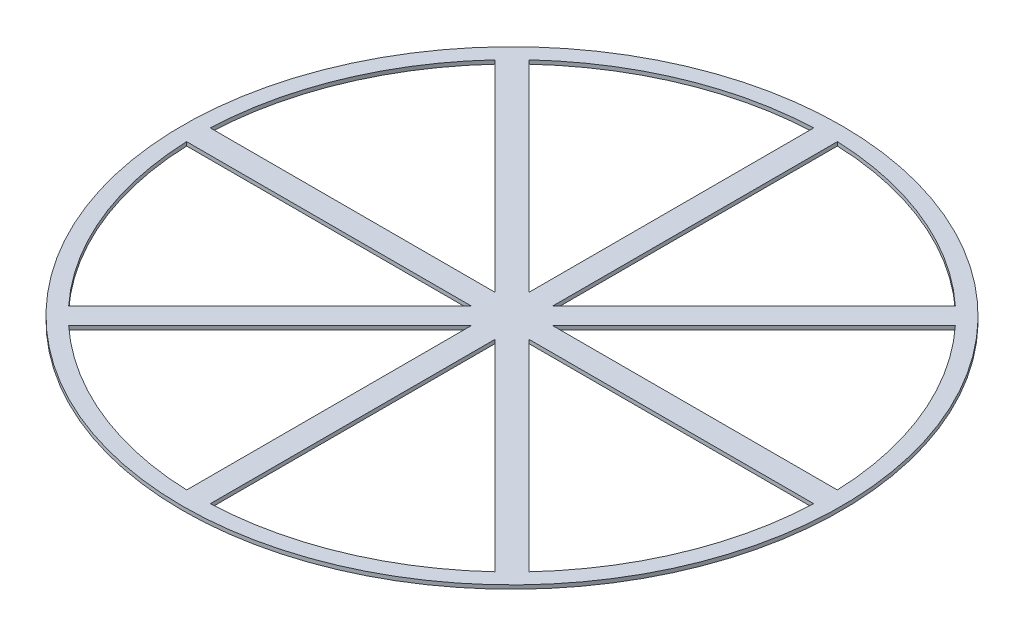
ISO-10303-21;
HEADER;
FILE_DESCRIPTION(('STEP AP214'),'2;1');
FILE_NAME('part.step','',(''),(''),'','','');
FILE_SCHEMA(('AUTOMOTIVE_DESIGN { 1 0 10303 214 1 1 1 1 }'));
ENDSEC;
DATA;
#1=APPLICATION_CONTEXT('core data for automotive mechanical design processes');
#2=APPLICATION_PROTOCOL_DEFINITION('international standard','automotive_design',2000,#1);
#3=PRODUCT_CONTEXT('',#1,'mechanical');
#4=PRODUCT('Part','Part','',(#3));
#5=PRODUCT_RELATED_PRODUCT_CATEGORY('part','',(#4));
#6=PRODUCT_DEFINITION_FORMATION('','',#4);
#7=PRODUCT_DEFINITION_CONTEXT('part definition',#1,'design');
#8=PRODUCT_DEFINITION('design','',#6,#7);
#9=PRODUCT_DEFINITION_SHAPE('','',#8);
#10=(LENGTH_UNIT() NAMED_UNIT(*) SI_UNIT(.MILLI.,.METRE.));
#11=(NAMED_UNIT(*) PLANE_ANGLE_UNIT() SI_UNIT($,.RADIAN.));
#12=(NAMED_UNIT(*) SI_UNIT($,.STERADIAN.) SOLID_ANGLE_UNIT());
#13=UNCERTAINTY_MEASURE_WITH_UNIT(LENGTH_MEASURE(1.E-05),#10,'distance_accuracy_value','');
#14=(GEOMETRIC_REPRESENTATION_CONTEXT(3) GLOBAL_UNCERTAINTY_ASSIGNED_CONTEXT((#13)) GLOBAL_UNIT_ASSIGNED_CONTEXT((#10,
#11,#12)) REPRESENTATION_CONTEXT('',''));
#15=CARTESIAN_POINT('',(0.,0.,0.));
#16=DIRECTION('',(0.,0.,1.));
#17=DIRECTION('',(1.,0.,0.));
#18=AXIS2_PLACEMENT_3D('',#15,#16,#17);
#19=CARTESIAN_POINT('',(0.,1.524,0.));
#20=DIRECTION('',(0.,-1.,0.));
#21=DIRECTION('',(0.,0.,-1.));
#22=AXIS2_PLACEMENT_3D('',#19,#20,#21);
#23=CYLINDRICAL_SURFACE('',#22,125.984);
#24=CARTESIAN_POINT('',(0.,0.,0.));
#25=DIRECTION('',(0.,1.,0.));
#26=DIRECTION('',(0.,0.,1.));
#27=AXIS2_PLACEMENT_3D('',#24,#25,#26);
#28=CIRCLE('',#27,125.984);
#29=CARTESIAN_POINT('',(-4.76249999999991,0.,-125.89395080682));
#30=VERTEX_POINT('',#29);
#31=CARTESIAN_POINT('',(-85.6528702804671,0.,-92.3880623712689));
#32=VERTEX_POINT('',#31);
#33=EDGE_CURVE('E210',#30,#32,#28,.T.);
#34=ORIENTED_EDGE('',*,*,#33,.F.);
#35=DIRECTION('',(0.,-1.,0.));
#36=VECTOR('',#35,1.);
#37=CARTESIAN_POINT('',(-4.76249999999991,1.524,-125.89395080682));
#38=LINE('',#37,#36);
#39=CARTESIAN_POINT('',(-4.76249999999991,1.524,-125.89395080682));
#40=VERTEX_POINT('',#39);
#41=EDGE_CURVE('E11',#40,#30,#38,.T.);
#42=ORIENTED_EDGE('',*,*,#41,.F.);
#43=CARTESIAN_POINT('',(0.,1.524,0.));
#44=DIRECTION('',(0.,1.,0.));
#45=DIRECTION('',(0.,0.,1.));
#46=AXIS2_PLACEMENT_3D('',#43,#44,#45);
#47=CIRCLE('',#46,125.984);
#48=CARTESIAN_POINT('',(-85.6528702804671,1.524,-92.3880623712689));
#49=VERTEX_POINT('',#48);
#50=EDGE_CURVE('E208',#40,#49,#47,.T.);
#51=ORIENTED_EDGE('',*,*,#50,.T.);
#52=DIRECTION('',(0.,-1.,0.));
#53=VECTOR('',#52,1.);
#54=CARTESIAN_POINT('',(-85.6528702804671,1.524,-92.3880623712689));
#55=LINE('',#54,#53);
#56=EDGE_CURVE('E60',#49,#32,#55,.T.);
#57=ORIENTED_EDGE('',*,*,#56,.T.);
#58=EDGE_LOOP('',(#34,#42,#51,#57));
#59=FACE_BOUND('',#58,.T.);
#60=ADVANCED_FACE('F41',(#59),#23,.F.);
#61=CARTESIAN_POINT('',(-4.76249999999999,1.524,0.));
#62=DIRECTION('',(1.,0.,0.));
#63=DIRECTION('',(0.,0.,-1.));
#64=AXIS2_PLACEMENT_3D('',#61,#62,#63);
#65=PLANE('',#64);
#66=DIRECTION('',(0.,0.,1.));
#67=VECTOR('',#66,1.);
#68=CARTESIAN_POINT('',(-4.76249999999999,0.,0.));
#69=LINE('',#68,#67);
#70=CARTESIAN_POINT('',(-4.76249999999998,0.,-11.4976920908018));
#71=VERTEX_POINT('',#70);
#72=EDGE_CURVE('E296',#30,#71,#69,.T.);
#73=ORIENTED_EDGE('',*,*,#72,.T.);
#74=DIRECTION('',(0.,-1.,0.));
#75=VECTOR('',#74,1.);
#76=CARTESIAN_POINT('',(-4.76249999999998,1.524,-11.4976920908018));
#77=LINE('',#76,#75);
#78=CARTESIAN_POINT('',(-4.76249999999998,1.524,-11.4976920908018));
#79=VERTEX_POINT('',#78);
#80=EDGE_CURVE('E51',#79,#71,#77,.T.);
#81=ORIENTED_EDGE('',*,*,#80,.F.);
#82=DIRECTION('',(0.,0.,1.));
#83=VECTOR('',#82,1.);
#84=CARTESIAN_POINT('',(-4.76249999999999,1.524,0.));
#85=LINE('',#84,#83);
#86=EDGE_CURVE('E213',#40,#79,#85,.T.);
#87=ORIENTED_EDGE('',*,*,#86,.F.);
#88=ORIENTED_EDGE('',*,*,#41,.T.);
#89=EDGE_LOOP('',(#73,#81,#87,#88));
#90=FACE_BOUND('',#89,.T.);
#91=ADVANCED_FACE('F214',(#90),#65,.F.);
#92=CARTESIAN_POINT('',(0.,1.524,0.));
#93=DIRECTION('',(0.,-1.,0.));
#94=DIRECTION('',(0.,0.,-1.));
#95=AXIS2_PLACEMENT_3D('',#92,#93,#94);
#96=CYLINDRICAL_SURFACE('',#95,125.984);
#97=CARTESIAN_POINT('',(0.,0.,0.));
#98=DIRECTION('',(0.,1.,0.));
#99=DIRECTION('',(0.,0.,1.));
#100=AXIS2_PLACEMENT_3D('',#97,#98,#99);
#101=CIRCLE('',#100,125.984);
#102=CARTESIAN_POINT('',(85.6528702804671,0.,-92.3880623712689));
#103=VERTEX_POINT('',#102);
#104=CARTESIAN_POINT('',(4.76249999999991,0.,-125.89395080682));
#105=VERTEX_POINT('',#104);
#106=EDGE_CURVE('E286',#103,#105,#101,.T.);
#107=ORIENTED_EDGE('',*,*,#106,.F.);
#108=DIRECTION('',(0.,-1.,0.));
#109=VECTOR('',#108,1.);
#110=CARTESIAN_POINT('',(85.6528702804671,1.524,-92.3880623712689));
#111=LINE('',#110,#109);
#112=CARTESIAN_POINT('',(85.6528702804671,1.524,-92.3880623712689));
#113=VERTEX_POINT('',#112);
#114=EDGE_CURVE('E306',#113,#103,#111,.T.);
#115=ORIENTED_EDGE('',*,*,#114,.F.);
#116=CARTESIAN_POINT('',(0.,1.524,0.));
#117=DIRECTION('',(0.,1.,0.));
#118=DIRECTION('',(0.,0.,1.));
#119=AXIS2_PLACEMENT_3D('',#116,#117,#118);
#120=CIRCLE('',#119,125.984);
#121=CARTESIAN_POINT('',(4.76249999999991,1.524,-125.89395080682));
#122=VERTEX_POINT('',#121);
#123=EDGE_CURVE('E404',#113,#122,#120,.T.);
#124=ORIENTED_EDGE('',*,*,#123,.T.);
#125=DIRECTION('',(0.,-1.,0.));
#126=VECTOR('',#125,1.);
#127=CARTESIAN_POINT('',(4.76249999999991,1.524,-125.89395080682));
#128=LINE('',#127,#126);
#129=EDGE_CURVE('E308',#122,#105,#128,.T.);
#130=ORIENTED_EDGE('',*,*,#129,.T.);
#131=EDGE_LOOP('',(#107,#115,#124,#130));
#132=FACE_BOUND('',#131,.T.);
#133=ADVANCED_FACE('F419',(#132),#96,.F.);
#134=CARTESIAN_POINT('',(-3.36759604540092,1.524,-3.36759604540093));
#135=DIRECTION('',(0.707106781186547,0.,0.707106781186548));
#136=DIRECTION('',(0.707106781186548,0.,-0.707106781186547));
#137=AXIS2_PLACEMENT_3D('',#134,#135,#136);
#138=PLANE('',#137);
#139=DIRECTION('',(-0.707106781186548,0.,0.707106781186547));
#140=VECTOR('',#139,1.);
#141=CARTESIAN_POINT('',(-3.36759604540092,0.,-3.36759604540093));
#142=LINE('',#141,#140);
#143=CARTESIAN_POINT('',(4.7625,0.,-11.4976920908018));
#144=VERTEX_POINT('',#143);
#145=EDGE_CURVE('E289',#103,#144,#142,.T.);
#146=ORIENTED_EDGE('',*,*,#145,.T.);
#147=DIRECTION('',(0.,-1.,0.));
#148=VECTOR('',#147,1.);
#149=CARTESIAN_POINT('',(4.7625,1.524,-11.4976920908018));
#150=LINE('',#149,#148);
#151=CARTESIAN_POINT('',(4.7625,1.524,-11.4976920908018));
#152=VERTEX_POINT('',#151);
#153=EDGE_CURVE('E310',#152,#144,#150,.T.);
#154=ORIENTED_EDGE('',*,*,#153,.F.);
#155=DIRECTION('',(-0.707106781186548,0.,0.707106781186547));
#156=VECTOR('',#155,1.);
#157=CARTESIAN_POINT('',(-3.36759604540092,1.524,-3.36759604540093));
#158=LINE('',#157,#156);
#159=EDGE_CURVE('E223',#113,#152,#158,.T.);
#160=ORIENTED_EDGE('',*,*,#159,.F.);
#161=ORIENTED_EDGE('',*,*,#114,.T.);
#162=EDGE_LOOP('',(#146,#154,#160,#161));
#163=FACE_BOUND('',#162,.T.);
#164=ADVANCED_FACE('F412',(#163),#138,.F.);
#165=CARTESIAN_POINT('',(0.,1.524,0.));
#166=DIRECTION('',(0.,-1.,0.));
#167=DIRECTION('',(0.,0.,-1.));
#168=AXIS2_PLACEMENT_3D('',#165,#166,#167);
#169=CYLINDRICAL_SURFACE('',#168,125.984);
#170=CARTESIAN_POINT('',(0.,0.,0.));
#171=DIRECTION('',(0.,1.,0.));
#172=DIRECTION('',(0.,0.,1.));
#173=AXIS2_PLACEMENT_3D('',#170,#171,#172);
#174=CIRCLE('',#173,125.984);
#175=CARTESIAN_POINT('',(125.89395080682,0.,-4.7625000000001));
#176=VERTEX_POINT('',#175);
#177=CARTESIAN_POINT('',(92.3880623712689,0.,-85.6528702804671));
#178=VERTEX_POINT('',#177);
#179=EDGE_CURVE('E277',#176,#178,#174,.T.);
#180=ORIENTED_EDGE('',*,*,#179,.F.);
#181=DIRECTION('',(0.,-1.,0.));
#182=VECTOR('',#181,1.);
#183=CARTESIAN_POINT('',(125.89395080682,1.524,-4.7625000000001));
#184=LINE('',#183,#182);
#185=CARTESIAN_POINT('',(125.89395080682,1.524,-4.7625000000001));
#186=VERTEX_POINT('',#185);
#187=EDGE_CURVE('E311',#186,#176,#184,.T.);
#188=ORIENTED_EDGE('',*,*,#187,.F.);
#189=CARTESIAN_POINT('',(0.,1.524,0.));
#190=DIRECTION('',(0.,1.,0.));
#191=DIRECTION('',(0.,0.,1.));
#192=AXIS2_PLACEMENT_3D('',#189,#190,#191);
#193=CIRCLE('',#192,125.984);
#194=CARTESIAN_POINT('',(92.3880623712689,1.524,-85.6528702804671));
#195=VERTEX_POINT('',#194);
#196=EDGE_CURVE('E396',#186,#195,#193,.T.);
#197=ORIENTED_EDGE('',*,*,#196,.T.);
#198=DIRECTION('',(0.,-1.,0.));
#199=VECTOR('',#198,1.);
#200=CARTESIAN_POINT('',(92.3880623712689,1.524,-85.6528702804671));
#201=LINE('',#200,#199);
#202=EDGE_CURVE('E314',#195,#178,#201,.T.);
#203=ORIENTED_EDGE('',*,*,#202,.T.);
#204=EDGE_LOOP('',(#180,#188,#197,#203));
#205=FACE_BOUND('',#204,.T.);
#206=ADVANCED_FACE('F453',(#205),#169,.F.);
#207=CARTESIAN_POINT('',(0.,1.524,-4.76249999999997));
#208=DIRECTION('',(0.,0.,1.));
#209=DIRECTION('',(1.,0.,0.));
#210=AXIS2_PLACEMENT_3D('',#207,#208,#209);
#211=PLANE('',#210);
#212=DIRECTION('',(-1.,0.,0.));
#213=VECTOR('',#212,1.);
#214=CARTESIAN_POINT('',(0.,0.,-4.76249999999997));
#215=LINE('',#214,#213);
#216=CARTESIAN_POINT('',(11.4976920908019,0.,-4.76249999999998));
#217=VERTEX_POINT('',#216);
#218=EDGE_CURVE('E280',#176,#217,#215,.T.);
#219=ORIENTED_EDGE('',*,*,#218,.T.);
#220=DIRECTION('',(0.,-1.,0.));
#221=VECTOR('',#220,1.);
#222=CARTESIAN_POINT('',(11.4976920908019,1.524,-4.76249999999998));
#223=LINE('',#222,#221);
#224=CARTESIAN_POINT('',(11.4976920908019,1.524,-4.76249999999998));
#225=VERTEX_POINT('',#224);
#226=EDGE_CURVE('E316',#225,#217,#223,.T.);
#227=ORIENTED_EDGE('',*,*,#226,.F.);
#228=DIRECTION('',(-1.,0.,0.));
#229=VECTOR('',#228,1.);
#230=CARTESIAN_POINT('',(0.,1.524,-4.76249999999997));
#231=LINE('',#230,#229);
#232=EDGE_CURVE('E399',#186,#225,#231,.T.);
#233=ORIENTED_EDGE('',*,*,#232,.F.);
#234=ORIENTED_EDGE('',*,*,#187,.T.);
#235=EDGE_LOOP('',(#219,#227,#233,#234));
#236=FACE_BOUND('',#235,.T.);
#237=ADVANCED_FACE('F460',(#236),#211,.F.);
#238=CARTESIAN_POINT('',(0.,1.524,0.));
#239=DIRECTION('',(0.,-1.,0.));
#240=DIRECTION('',(0.,0.,-1.));
#241=AXIS2_PLACEMENT_3D('',#238,#239,#240);
#242=CYLINDRICAL_SURFACE('',#241,125.984);
#243=CARTESIAN_POINT('',(0.,0.,0.));
#244=DIRECTION('',(0.,1.,0.));
#245=DIRECTION('',(0.,0.,1.));
#246=AXIS2_PLACEMENT_3D('',#243,#244,#245);
#247=CIRCLE('',#246,125.984);
#248=CARTESIAN_POINT('',(92.3880623712689,0.,85.6528702804671));
#249=VERTEX_POINT('',#248);
#250=CARTESIAN_POINT('',(125.89395080682,0.,4.7625000000001));
#251=VERTEX_POINT('',#250);
#252=EDGE_CURVE('E268',#249,#251,#247,.T.);
#253=ORIENTED_EDGE('',*,*,#252,.F.);
#254=DIRECTION('',(0.,-1.,0.));
#255=VECTOR('',#254,1.);
#256=CARTESIAN_POINT('',(92.3880623712689,1.524,85.6528702804671));
#257=LINE('',#256,#255);
#258=CARTESIAN_POINT('',(92.3880623712689,1.524,85.6528702804671));
#259=VERTEX_POINT('',#258);
#260=EDGE_CURVE('E317',#259,#249,#257,.T.);
#261=ORIENTED_EDGE('',*,*,#260,.F.);
#262=CARTESIAN_POINT('',(0.,1.524,0.));
#263=DIRECTION('',(0.,1.,0.));
#264=DIRECTION('',(0.,0.,1.));
#265=AXIS2_PLACEMENT_3D('',#262,#263,#264);
#266=CIRCLE('',#265,125.984);
#267=CARTESIAN_POINT('',(125.89395080682,1.524,4.7625000000001));
#268=VERTEX_POINT('',#267);
#269=EDGE_CURVE('E388',#259,#268,#266,.T.);
#270=ORIENTED_EDGE('',*,*,#269,.T.);
#271=DIRECTION('',(0.,-1.,0.));
#272=VECTOR('',#271,1.);
#273=CARTESIAN_POINT('',(125.89395080682,1.524,4.7625000000001));
#274=LINE('',#273,#272);
#275=EDGE_CURVE('E320',#268,#251,#274,.T.);
#276=ORIENTED_EDGE('',*,*,#275,.T.);
#277=EDGE_LOOP('',(#253,#261,#270,#276));
#278=FACE_BOUND('',#277,.T.);
#279=ADVANCED_FACE('F463',(#278),#242,.F.);
#280=CARTESIAN_POINT('',(3.36759604540093,1.524,-3.36759604540092));
#281=DIRECTION('',(-0.707106781186548,0.,0.707106781186547));
#282=DIRECTION('',(0.707106781186547,0.,0.707106781186548));
#283=AXIS2_PLACEMENT_3D('',#280,#281,#282);
#284=PLANE('',#283);
#285=DIRECTION('',(-0.707106781186547,0.,-0.707106781186548));
#286=VECTOR('',#285,1.);
#287=CARTESIAN_POINT('',(3.36759604540093,0.,-3.36759604540092));
#288=LINE('',#287,#286);
#289=CARTESIAN_POINT('',(11.4976920908018,0.,4.76249999999999));
#290=VERTEX_POINT('',#289);
#291=EDGE_CURVE('E271',#249,#290,#288,.T.);
#292=ORIENTED_EDGE('',*,*,#291,.T.);
#293=DIRECTION('',(0.,-1.,0.));
#294=VECTOR('',#293,1.);
#295=CARTESIAN_POINT('',(11.4976920908018,1.524,4.76249999999999));
#296=LINE('',#295,#294);
#297=CARTESIAN_POINT('',(11.4976920908018,1.524,4.76249999999999));
#298=VERTEX_POINT('',#297);
#299=EDGE_CURVE('E322',#298,#290,#296,.T.);
#300=ORIENTED_EDGE('',*,*,#299,.F.);
#301=DIRECTION('',(-0.707106781186547,0.,-0.707106781186548));
#302=VECTOR('',#301,1.);
#303=CARTESIAN_POINT('',(3.36759604540093,1.524,-3.36759604540092));
#304=LINE('',#303,#302);
#305=EDGE_CURVE('E391',#259,#298,#304,.T.);
#306=ORIENTED_EDGE('',*,*,#305,.F.);
#307=ORIENTED_EDGE('',*,*,#260,.T.);
#308=EDGE_LOOP('',(#292,#300,#306,#307));
#309=FACE_BOUND('',#308,.T.);
#310=ADVANCED_FACE('F472',(#309),#284,.F.);
#311=CARTESIAN_POINT('',(0.,1.524,0.));
#312=DIRECTION('',(0.,-1.,0.));
#313=DIRECTION('',(0.,0.,-1.));
#314=AXIS2_PLACEMENT_3D('',#311,#312,#313);
#315=CYLINDRICAL_SURFACE('',#314,125.984);
#316=CARTESIAN_POINT('',(0.,0.,0.));
#317=DIRECTION('',(0.,1.,0.));
#318=DIRECTION('',(0.,0.,1.));
#319=AXIS2_PLACEMENT_3D('',#316,#317,#318);
#320=CIRCLE('',#319,125.984);
#321=CARTESIAN_POINT('',(4.76249999999991,0.,125.89395080682));
#322=VERTEX_POINT('',#321);
#323=CARTESIAN_POINT('',(85.6528702804671,0.,92.3880623712689));
#324=VERTEX_POINT('',#323);
#325=EDGE_CURVE('E259',#322,#324,#320,.T.);
#326=ORIENTED_EDGE('',*,*,#325,.F.);
#327=DIRECTION('',(0.,-1.,0.));
#328=VECTOR('',#327,1.);
#329=CARTESIAN_POINT('',(4.76249999999991,1.524,125.89395080682));
#330=LINE('',#329,#328);
#331=CARTESIAN_POINT('',(4.76249999999991,1.524,125.89395080682));
#332=VERTEX_POINT('',#331);
#333=EDGE_CURVE('E323',#332,#322,#330,.T.);
#334=ORIENTED_EDGE('',*,*,#333,.F.);
#335=CARTESIAN_POINT('',(0.,1.524,0.));
#336=DIRECTION('',(0.,1.,0.));
#337=DIRECTION('',(0.,0.,1.));
#338=AXIS2_PLACEMENT_3D('',#335,#336,#337);
#339=CIRCLE('',#338,125.984);
#340=CARTESIAN_POINT('',(85.6528702804671,1.524,92.3880623712689));
#341=VERTEX_POINT('',#340);
#342=EDGE_CURVE('E380',#332,#341,#339,.T.);
#343=ORIENTED_EDGE('',*,*,#342,.T.);
#344=DIRECTION('',(0.,-1.,0.));
#345=VECTOR('',#344,1.);
#346=CARTESIAN_POINT('',(85.6528702804671,1.524,92.3880623712689));
#347=LINE('',#346,#345);
#348=EDGE_CURVE('E326',#341,#324,#347,.T.);
#349=ORIENTED_EDGE('',*,*,#348,.T.);
#350=EDGE_LOOP('',(#326,#334,#343,#349));
#351=FACE_BOUND('',#350,.T.);
#352=ADVANCED_FACE('F475',(#351),#315,.F.);
#353=CARTESIAN_POINT('',(4.7625,1.524,0.));
#354=DIRECTION('',(-1.,0.,0.));
#355=DIRECTION('',(0.,0.,1.));
#356=AXIS2_PLACEMENT_3D('',#353,#354,#355);
#357=PLANE('',#356);
#358=DIRECTION('',(0.,0.,-1.));
#359=VECTOR('',#358,1.);
#360=CARTESIAN_POINT('',(4.7625,0.,0.));
#361=LINE('',#360,#359);
#362=CARTESIAN_POINT('',(4.7625,0.,11.4976920908019));
#363=VERTEX_POINT('',#362);
#364=EDGE_CURVE('E262',#322,#363,#361,.T.);
#365=ORIENTED_EDGE('',*,*,#364,.T.);
#366=DIRECTION('',(0.,-1.,0.));
#367=VECTOR('',#366,1.);
#368=CARTESIAN_POINT('',(4.7625,1.524,11.4976920908019));
#369=LINE('',#368,#367);
#370=CARTESIAN_POINT('',(4.7625,1.524,11.4976920908019));
#371=VERTEX_POINT('',#370);
#372=EDGE_CURVE('E328',#371,#363,#369,.T.);
#373=ORIENTED_EDGE('',*,*,#372,.F.);
#374=DIRECTION('',(0.,0.,-1.));
#375=VECTOR('',#374,1.);
#376=CARTESIAN_POINT('',(4.7625,1.524,0.));
#377=LINE('',#376,#375);
#378=EDGE_CURVE('E383',#332,#371,#377,.T.);
#379=ORIENTED_EDGE('',*,*,#378,.F.);
#380=ORIENTED_EDGE('',*,*,#333,.T.);
#381=EDGE_LOOP('',(#365,#373,#379,#380));
#382=FACE_BOUND('',#381,.T.);
#383=ADVANCED_FACE('F484',(#382),#357,.F.);
#384=CARTESIAN_POINT('',(0.,1.524,0.));
#385=DIRECTION('',(0.,-1.,0.));
#386=DIRECTION('',(0.,0.,-1.));
#387=AXIS2_PLACEMENT_3D('',#384,#385,#386);
#388=CYLINDRICAL_SURFACE('',#387,125.984);
#389=CARTESIAN_POINT('',(0.,0.,0.));
#390=DIRECTION('',(0.,1.,0.));
#391=DIRECTION('',(0.,0.,1.));
#392=AXIS2_PLACEMENT_3D('',#389,#390,#391);
#393=CIRCLE('',#392,125.984);
#394=CARTESIAN_POINT('',(-85.6528702804671,0.,92.3880623712689));
#395=VERTEX_POINT('',#394);
#396=CARTESIAN_POINT('',(-4.76249999999991,0.,125.89395080682));
#397=VERTEX_POINT('',#396);
#398=EDGE_CURVE('E250',#395,#397,#393,.T.);
#399=ORIENTED_EDGE('',*,*,#398,.F.);
#400=DIRECTION('',(0.,-1.,0.));
#401=VECTOR('',#400,1.);
#402=CARTESIAN_POINT('',(-85.6528702804671,1.524,92.3880623712689));
#403=LINE('',#402,#401);
#404=CARTESIAN_POINT('',(-85.6528702804671,1.524,92.3880623712689));
#405=VERTEX_POINT('',#404);
#406=EDGE_CURVE('E329',#405,#395,#403,.T.);
#407=ORIENTED_EDGE('',*,*,#406,.F.);
#408=CARTESIAN_POINT('',(0.,1.524,0.));
#409=DIRECTION('',(0.,1.,0.));
#410=DIRECTION('',(0.,0.,1.));
#411=AXIS2_PLACEMENT_3D('',#408,#409,#410);
#412=CIRCLE('',#411,125.984);
#413=CARTESIAN_POINT('',(-4.76249999999991,1.524,125.89395080682));
#414=VERTEX_POINT('',#413);
#415=EDGE_CURVE('E372',#405,#414,#412,.T.);
#416=ORIENTED_EDGE('',*,*,#415,.T.);
#417=DIRECTION('',(0.,-1.,0.));
#418=VECTOR('',#417,1.);
#419=CARTESIAN_POINT('',(-4.76249999999991,1.524,125.89395080682));
#420=LINE('',#419,#418);
#421=EDGE_CURVE('E332',#414,#397,#420,.T.);
#422=ORIENTED_EDGE('',*,*,#421,.T.);
#423=EDGE_LOOP('',(#399,#407,#416,#422));
#424=FACE_BOUND('',#423,.T.);
#425=ADVANCED_FACE('F487',(#424),#388,.F.);
#426=CARTESIAN_POINT('',(3.36759604540092,1.524,3.36759604540093));
#427=DIRECTION('',(-0.707106781186547,0.,-0.707106781186548));
#428=DIRECTION('',(-0.707106781186548,0.,0.707106781186547));
#429=AXIS2_PLACEMENT_3D('',#426,#427,#428);
#430=PLANE('',#429);
#431=DIRECTION('',(0.707106781186548,0.,-0.707106781186547));
#432=VECTOR('',#431,1.);
#433=CARTESIAN_POINT('',(3.36759604540092,0.,3.36759604540093));
#434=LINE('',#433,#432);
#435=CARTESIAN_POINT('',(-4.7625,0.,11.4976920908018));
#436=VERTEX_POINT('',#435);
#437=EDGE_CURVE('E253',#395,#436,#434,.T.);
#438=ORIENTED_EDGE('',*,*,#437,.T.);
#439=DIRECTION('',(0.,-1.,0.));
#440=VECTOR('',#439,1.);
#441=CARTESIAN_POINT('',(-4.7625,1.524,11.4976920908018));
#442=LINE('',#441,#440);
#443=CARTESIAN_POINT('',(-4.7625,1.524,11.4976920908018));
#444=VERTEX_POINT('',#443);
#445=EDGE_CURVE('E334',#444,#436,#442,.T.);
#446=ORIENTED_EDGE('',*,*,#445,.F.);
#447=DIRECTION('',(0.707106781186548,0.,-0.707106781186547));
#448=VECTOR('',#447,1.);
#449=CARTESIAN_POINT('',(3.36759604540092,1.524,3.36759604540093));
#450=LINE('',#449,#448);
#451=EDGE_CURVE('E375',#405,#444,#450,.T.);
#452=ORIENTED_EDGE('',*,*,#451,.F.);
#453=ORIENTED_EDGE('',*,*,#406,.T.);
#454=EDGE_LOOP('',(#438,#446,#452,#453));
#455=FACE_BOUND('',#454,.T.);
#456=ADVANCED_FACE('F495',(#455),#430,.F.);
#457=CARTESIAN_POINT('',(0.,1.524,0.));
#458=DIRECTION('',(0.,-1.,0.));
#459=DIRECTION('',(0.,0.,-1.));
#460=AXIS2_PLACEMENT_3D('',#457,#458,#459);
#461=CYLINDRICAL_SURFACE('',#460,125.984);
#462=CARTESIAN_POINT('',(0.,0.,0.));
#463=DIRECTION('',(0.,1.,0.));
#464=DIRECTION('',(0.,0.,1.));
#465=AXIS2_PLACEMENT_3D('',#462,#463,#464);
#466=CIRCLE('',#465,125.984);
#467=CARTESIAN_POINT('',(-125.89395080682,0.,4.76249999999986));
#468=VERTEX_POINT('',#467);
#469=CARTESIAN_POINT('',(-92.3880623712689,0.,85.6528702804671));
#470=VERTEX_POINT('',#469);
#471=EDGE_CURVE('E241',#468,#470,#466,.T.);
#472=ORIENTED_EDGE('',*,*,#471,.F.);
#473=DIRECTION('',(0.,-1.,0.));
#474=VECTOR('',#473,1.);
#475=CARTESIAN_POINT('',(-125.89395080682,1.524,4.76249999999986));
#476=LINE('',#475,#474);
#477=CARTESIAN_POINT('',(-125.89395080682,1.524,4.76249999999986));
#478=VERTEX_POINT('',#477);
#479=EDGE_CURVE('E335',#478,#468,#476,.T.);
#480=ORIENTED_EDGE('',*,*,#479,.F.);
#481=CARTESIAN_POINT('',(0.,1.524,0.));
#482=DIRECTION('',(0.,1.,0.));
#483=DIRECTION('',(0.,0.,1.));
#484=AXIS2_PLACEMENT_3D('',#481,#482,#483);
#485=CIRCLE('',#484,125.984);
#486=CARTESIAN_POINT('',(-92.3880623712689,1.524,85.6528702804671));
#487=VERTEX_POINT('',#486);
#488=EDGE_CURVE('E360',#478,#487,#485,.T.);
#489=ORIENTED_EDGE('',*,*,#488,.T.);
#490=DIRECTION('',(0.,-1.,0.));
#491=VECTOR('',#490,1.);
#492=CARTESIAN_POINT('',(-92.3880623712689,1.524,85.6528702804671));
#493=LINE('',#492,#491);
#494=EDGE_CURVE('E338',#487,#470,#493,.T.);
#495=ORIENTED_EDGE('',*,*,#494,.T.);
#496=EDGE_LOOP('',(#472,#480,#489,#495));
#497=FACE_BOUND('',#496,.T.);
#498=ADVANCED_FACE('F498',(#497),#461,.F.);
#499=CARTESIAN_POINT('',(0.,1.524,4.76250000000002));
#500=DIRECTION('',(0.,0.,-1.));
#501=DIRECTION('',(-1.,0.,0.));
#502=AXIS2_PLACEMENT_3D('',#499,#500,#501);
#503=PLANE('',#502);
#504=DIRECTION('',(1.,0.,0.));
#505=VECTOR('',#504,1.);
#506=CARTESIAN_POINT('',(0.,0.,4.76250000000002));
#507=LINE('',#506,#505);
#508=CARTESIAN_POINT('',(-11.4976920908018,0.,4.7625));
#509=VERTEX_POINT('',#508);
#510=EDGE_CURVE('E244',#468,#509,#507,.T.);
#511=ORIENTED_EDGE('',*,*,#510,.T.);
#512=DIRECTION('',(0.,-1.,0.));
#513=VECTOR('',#512,1.);
#514=CARTESIAN_POINT('',(-11.4976920908018,1.524,4.7625));
#515=LINE('',#514,#513);
#516=CARTESIAN_POINT('',(-11.4976920908018,1.524,4.7625));
#517=VERTEX_POINT('',#516);
#518=EDGE_CURVE('E340',#517,#509,#515,.T.);
#519=ORIENTED_EDGE('',*,*,#518,.F.);
#520=DIRECTION('',(1.,0.,0.));
#521=VECTOR('',#520,1.);
#522=CARTESIAN_POINT('',(0.,1.524,4.76250000000002));
#523=LINE('',#522,#521);
#524=EDGE_CURVE('E363',#478,#517,#523,.T.);
#525=ORIENTED_EDGE('',*,*,#524,.F.);
#526=ORIENTED_EDGE('',*,*,#479,.T.);
#527=EDGE_LOOP('',(#511,#519,#525,#526));
#528=FACE_BOUND('',#527,.T.);
#529=ADVANCED_FACE('F506',(#528),#503,.F.);
#530=CARTESIAN_POINT('',(0.,1.524,0.));
#531=DIRECTION('',(0.,-1.,0.));
#532=DIRECTION('',(0.,0.,-1.));
#533=AXIS2_PLACEMENT_3D('',#530,#531,#532);
#534=CYLINDRICAL_SURFACE('',#533,125.984);
#535=CARTESIAN_POINT('',(0.,0.,0.));
#536=DIRECTION('',(0.,1.,0.));
#537=DIRECTION('',(0.,0.,1.));
#538=AXIS2_PLACEMENT_3D('',#535,#536,#537);
#539=CIRCLE('',#538,125.984);
#540=CARTESIAN_POINT('',(-92.3880623712689,0.,-85.6528702804671));
#541=VERTEX_POINT('',#540);
#542=CARTESIAN_POINT('',(-125.89395080682,0.,-4.7625));
#543=VERTEX_POINT('',#542);
#544=EDGE_CURVE('E232',#541,#543,#539,.T.);
#545=ORIENTED_EDGE('',*,*,#544,.F.);
#546=DIRECTION('',(0.,-1.,0.));
#547=VECTOR('',#546,1.);
#548=CARTESIAN_POINT('',(-92.3880623712689,1.524,-85.6528702804671));
#549=LINE('',#548,#547);
#550=CARTESIAN_POINT('',(-92.3880623712689,1.524,-85.6528702804671));
#551=VERTEX_POINT('',#550);
#552=EDGE_CURVE('E45',#551,#541,#549,.T.);
#553=ORIENTED_EDGE('',*,*,#552,.F.);
#554=CARTESIAN_POINT('',(0.,1.524,0.));
#555=DIRECTION('',(0.,1.,0.));
#556=DIRECTION('',(0.,0.,1.));
#557=AXIS2_PLACEMENT_3D('',#554,#555,#556);
#558=CIRCLE('',#557,125.984);
#559=CARTESIAN_POINT('',(-125.89395080682,1.524,-4.7625));
#560=VERTEX_POINT('',#559);
#561=EDGE_CURVE('E304',#551,#560,#558,.T.);
#562=ORIENTED_EDGE('',*,*,#561,.T.);
#563=DIRECTION('',(0.,-1.,0.));
#564=VECTOR('',#563,1.);
#565=CARTESIAN_POINT('',(-125.89395080682,1.524,-4.7625));
#566=LINE('',#565,#564);
#567=EDGE_CURVE('E231',#560,#543,#566,.T.);
#568=ORIENTED_EDGE('',*,*,#567,.T.);
#569=EDGE_LOOP('',(#545,#553,#562,#568));
#570=FACE_BOUND('',#569,.T.);
#571=ADVANCED_FACE('F43',(#570),#534,.F.);
#572=CARTESIAN_POINT('',(-3.36759604540093,1.524,3.36759604540093));
#573=DIRECTION('',(0.707106781186548,0.,-0.707106781186547));
#574=DIRECTION('',(-0.707106781186547,0.,-0.707106781186548));
#575=AXIS2_PLACEMENT_3D('',#572,#573,#574);
#576=PLANE('',#575);
#577=DIRECTION('',(0.707106781186547,0.,0.707106781186548));
#578=VECTOR('',#577,1.);
#579=CARTESIAN_POINT('',(-3.36759604540093,0.,3.36759604540093));
#580=LINE('',#579,#578);
#581=CARTESIAN_POINT('',(-11.4976920908018,0.,-4.76249999999999));
#582=VERTEX_POINT('',#581);
#583=EDGE_CURVE('E235',#541,#582,#580,.T.);
#584=ORIENTED_EDGE('',*,*,#583,.T.);
#585=DIRECTION('',(0.,-1.,0.));
#586=VECTOR('',#585,1.);
#587=CARTESIAN_POINT('',(-11.4976920908018,1.524,-4.76249999999999));
#588=LINE('',#587,#586);
#589=CARTESIAN_POINT('',(-11.4976920908018,1.524,-4.76249999999999));
#590=VERTEX_POINT('',#589);
#591=EDGE_CURVE('E343',#590,#582,#588,.T.);
#592=ORIENTED_EDGE('',*,*,#591,.F.);
#593=DIRECTION('',(0.707106781186547,0.,0.707106781186548));
#594=VECTOR('',#593,1.);
#595=CARTESIAN_POINT('',(-3.36759604540093,1.524,3.36759604540093));
#596=LINE('',#595,#594);
#597=EDGE_CURVE('E351',#551,#590,#596,.T.);
#598=ORIENTED_EDGE('',*,*,#597,.F.);
#599=ORIENTED_EDGE('',*,*,#552,.T.);
#600=EDGE_LOOP('',(#584,#592,#598,#599));
#601=FACE_BOUND('',#600,.T.);
#602=ADVANCED_FACE('F350',(#601),#576,.F.);
#603=CARTESIAN_POINT('',(3.36759604540092,1.524,-3.36759604540093));
#604=DIRECTION('',(0.707106781186547,0.,-0.707106781186548));
#605=DIRECTION('',(-0.707106781186548,0.,-0.707106781186547));
#606=AXIS2_PLACEMENT_3D('',#603,#604,#605);
#607=PLANE('',#606);
#608=DIRECTION('',(0.707106781186548,0.,0.707106781186547));
#609=VECTOR('',#608,1.);
#610=CARTESIAN_POINT('',(3.36759604540092,0.,-3.36759604540093));
#611=LINE('',#610,#609);
#612=EDGE_CURVE('E298',#32,#71,#611,.T.);
#613=ORIENTED_EDGE('',*,*,#612,.F.);
#614=ORIENTED_EDGE('',*,*,#56,.F.);
#615=DIRECTION('',(0.707106781186548,0.,0.707106781186547));
#616=VECTOR('',#615,1.);
#617=CARTESIAN_POINT('',(3.36759604540092,1.524,-3.36759604540093));
#618=LINE('',#617,#616);
#619=EDGE_CURVE('E216',#49,#79,#618,.T.);
#620=ORIENTED_EDGE('',*,*,#619,.T.);
#621=ORIENTED_EDGE('',*,*,#80,.T.);
#622=EDGE_LOOP('',(#613,#614,#620,#621));
#623=FACE_BOUND('',#622,.T.);
#624=ADVANCED_FACE('F450',(#623),#607,.T.);
#625=CARTESIAN_POINT('',(4.7625,1.524,0.));
#626=DIRECTION('',(1.,0.,0.));
#627=DIRECTION('',(0.,0.,-1.));
#628=AXIS2_PLACEMENT_3D('',#625,#626,#627);
#629=PLANE('',#628);
#630=DIRECTION('',(0.,0.,1.));
#631=VECTOR('',#630,1.);
#632=CARTESIAN_POINT('',(4.7625,0.,0.));
#633=LINE('',#632,#631);
#634=EDGE_CURVE('E292',#105,#144,#633,.T.);
#635=ORIENTED_EDGE('',*,*,#634,.F.);
#636=ORIENTED_EDGE('',*,*,#129,.F.);
#637=DIRECTION('',(0.,0.,1.));
#638=VECTOR('',#637,1.);
#639=CARTESIAN_POINT('',(4.7625,1.524,0.));
#640=LINE('',#639,#638);
#641=EDGE_CURVE('E220',#122,#152,#640,.T.);
#642=ORIENTED_EDGE('',*,*,#641,.T.);
#643=ORIENTED_EDGE('',*,*,#153,.T.);
#644=EDGE_LOOP('',(#635,#636,#642,#643));
#645=FACE_BOUND('',#644,.T.);
#646=ADVANCED_FACE('F416',(#645),#629,.T.);
#647=CARTESIAN_POINT('',(3.36759604540095,1.524,3.36759604540094));
#648=DIRECTION('',(0.707106781186548,0.,0.707106781186547));
#649=DIRECTION('',(0.707106781186547,0.,-0.707106781186548));
#650=AXIS2_PLACEMENT_3D('',#647,#648,#649);
#651=PLANE('',#650);
#652=DIRECTION('',(-0.707106781186547,0.,0.707106781186548));
#653=VECTOR('',#652,1.);
#654=CARTESIAN_POINT('',(3.36759604540095,0.,3.36759604540094));
#655=LINE('',#654,#653);
#656=EDGE_CURVE('E283',#178,#217,#655,.T.);
#657=ORIENTED_EDGE('',*,*,#656,.F.);
#658=ORIENTED_EDGE('',*,*,#202,.F.);
#659=DIRECTION('',(-0.707106781186547,0.,0.707106781186548));
#660=VECTOR('',#659,1.);
#661=CARTESIAN_POINT('',(3.36759604540095,1.524,3.36759604540094));
#662=LINE('',#661,#660);
#663=EDGE_CURVE('E401',#195,#225,#662,.T.);
#664=ORIENTED_EDGE('',*,*,#663,.T.);
#665=ORIENTED_EDGE('',*,*,#226,.T.);
#666=EDGE_LOOP('',(#657,#658,#664,#665));
#667=FACE_BOUND('',#666,.T.);
#668=ADVANCED_FACE('F449',(#667),#651,.T.);
#669=CARTESIAN_POINT('',(0.,1.524,4.76249999999998));
#670=DIRECTION('',(0.,0.,1.));
#671=DIRECTION('',(1.,0.,0.));
#672=AXIS2_PLACEMENT_3D('',#669,#670,#671);
#673=PLANE('',#672);
#674=DIRECTION('',(-1.,0.,0.));
#675=VECTOR('',#674,1.);
#676=CARTESIAN_POINT('',(0.,0.,4.76249999999998));
#677=LINE('',#676,#675);
#678=EDGE_CURVE('E274',#251,#290,#677,.T.);
#679=ORIENTED_EDGE('',*,*,#678,.F.);
#680=ORIENTED_EDGE('',*,*,#275,.F.);
#681=DIRECTION('',(-1.,0.,0.));
#682=VECTOR('',#681,1.);
#683=CARTESIAN_POINT('',(0.,1.524,4.76249999999998));
#684=LINE('',#683,#682);
#685=EDGE_CURVE('E393',#268,#298,#684,.T.);
#686=ORIENTED_EDGE('',*,*,#685,.T.);
#687=ORIENTED_EDGE('',*,*,#299,.T.);
#688=EDGE_LOOP('',(#679,#680,#686,#687));
#689=FACE_BOUND('',#688,.T.);
#690=ADVANCED_FACE('F458',(#689),#673,.T.);
#691=CARTESIAN_POINT('',(-3.36759604540094,1.524,3.36759604540095));
#692=DIRECTION('',(-0.707106781186547,0.,0.707106781186548));
#693=DIRECTION('',(0.707106781186548,0.,0.707106781186547));
#694=AXIS2_PLACEMENT_3D('',#691,#692,#693);
#695=PLANE('',#694);
#696=DIRECTION('',(-0.707106781186548,0.,-0.707106781186547));
#697=VECTOR('',#696,1.);
#698=CARTESIAN_POINT('',(-3.36759604540094,0.,3.36759604540095));
#699=LINE('',#698,#697);
#700=EDGE_CURVE('E265',#324,#363,#699,.T.);
#701=ORIENTED_EDGE('',*,*,#700,.F.);
#702=ORIENTED_EDGE('',*,*,#348,.F.);
#703=DIRECTION('',(-0.707106781186548,0.,-0.707106781186547));
#704=VECTOR('',#703,1.);
#705=CARTESIAN_POINT('',(-3.36759604540094,1.524,3.36759604540095));
#706=LINE('',#705,#704);
#707=EDGE_CURVE('E385',#341,#371,#706,.T.);
#708=ORIENTED_EDGE('',*,*,#707,.T.);
#709=ORIENTED_EDGE('',*,*,#372,.T.);
#710=EDGE_LOOP('',(#701,#702,#708,#709));
#711=FACE_BOUND('',#710,.T.);
#712=ADVANCED_FACE('F470',(#711),#695,.T.);
#713=CARTESIAN_POINT('',(-4.7625,1.524,0.));
#714=DIRECTION('',(-1.,0.,0.));
#715=DIRECTION('',(0.,0.,1.));
#716=AXIS2_PLACEMENT_3D('',#713,#714,#715);
#717=PLANE('',#716);
#718=DIRECTION('',(0.,0.,-1.));
#719=VECTOR('',#718,1.);
#720=CARTESIAN_POINT('',(-4.7625,0.,0.));
#721=LINE('',#720,#719);
#722=EDGE_CURVE('E256',#397,#436,#721,.T.);
#723=ORIENTED_EDGE('',*,*,#722,.F.);
#724=ORIENTED_EDGE('',*,*,#421,.F.);
#725=DIRECTION('',(0.,0.,-1.));
#726=VECTOR('',#725,1.);
#727=CARTESIAN_POINT('',(-4.7625,1.524,0.));
#728=LINE('',#727,#726);
#729=EDGE_CURVE('E377',#414,#444,#728,.T.);
#730=ORIENTED_EDGE('',*,*,#729,.T.);
#731=ORIENTED_EDGE('',*,*,#445,.T.);
#732=EDGE_LOOP('',(#723,#724,#730,#731));
#733=FACE_BOUND('',#732,.T.);
#734=ADVANCED_FACE('F482',(#733),#717,.T.);
#735=CARTESIAN_POINT('',(-3.36759604540092,1.524,-3.36759604540092));
#736=DIRECTION('',(-0.707106781186547,0.,-0.707106781186547));
#737=DIRECTION('',(-0.707106781186547,0.,0.707106781186548));
#738=AXIS2_PLACEMENT_3D('',#735,#736,#737);
#739=PLANE('',#738);
#740=DIRECTION('',(0.707106781186547,0.,-0.707106781186548));
#741=VECTOR('',#740,1.);
#742=CARTESIAN_POINT('',(-3.36759604540092,0.,-3.36759604540092));
#743=LINE('',#742,#741);
#744=EDGE_CURVE('E247',#470,#509,#743,.T.);
#745=ORIENTED_EDGE('',*,*,#744,.F.);
#746=ORIENTED_EDGE('',*,*,#494,.F.);
#747=DIRECTION('',(0.707106781186547,0.,-0.707106781186548));
#748=VECTOR('',#747,1.);
#749=CARTESIAN_POINT('',(-3.36759604540092,1.524,-3.36759604540092));
#750=LINE('',#749,#748);
#751=EDGE_CURVE('E369',#487,#517,#750,.T.);
#752=ORIENTED_EDGE('',*,*,#751,.T.);
#753=ORIENTED_EDGE('',*,*,#518,.T.);
#754=EDGE_LOOP('',(#745,#746,#752,#753));
#755=FACE_BOUND('',#754,.T.);
#756=ADVANCED_FACE('F436',(#755),#739,.T.);
#757=CARTESIAN_POINT('',(0.,1.524,-4.76249999999999));
#758=DIRECTION('',(0.,0.,-1.));
#759=DIRECTION('',(-1.,0.,0.));
#760=AXIS2_PLACEMENT_3D('',#757,#758,#759);
#761=PLANE('',#760);
#762=DIRECTION('',(1.,0.,0.));
#763=VECTOR('',#762,1.);
#764=CARTESIAN_POINT('',(0.,0.,-4.76249999999999));
#765=LINE('',#764,#763);
#766=EDGE_CURVE('E238',#543,#582,#765,.T.);
#767=ORIENTED_EDGE('',*,*,#766,.F.);
#768=ORIENTED_EDGE('',*,*,#567,.F.);
#769=DIRECTION('',(1.,0.,0.));
#770=VECTOR('',#769,1.);
#771=CARTESIAN_POINT('',(0.,1.524,-4.76249999999999));
#772=LINE('',#771,#770);
#773=EDGE_CURVE('E358',#560,#590,#772,.T.);
#774=ORIENTED_EDGE('',*,*,#773,.T.);
#775=ORIENTED_EDGE('',*,*,#591,.T.);
#776=EDGE_LOOP('',(#767,#768,#774,#775));
#777=FACE_BOUND('',#776,.T.);
#778=ADVANCED_FACE('F357',(#777),#761,.T.);
#779=CARTESIAN_POINT('',(0.,1.524,0.));
#780=DIRECTION('',(0.,-1.,0.));
#781=DIRECTION('',(0.,0.,-1.));
#782=AXIS2_PLACEMENT_3D('',#779,#780,#781);
#783=CYLINDRICAL_SURFACE('',#782,132.334);
#784=CARTESIAN_POINT('',(0.,1.524,0.));
#785=DIRECTION('',(0.,1.,0.));
#786=DIRECTION('',(0.,0.,1.));
#787=AXIS2_PLACEMENT_3D('',#784,#785,#786);
#788=CIRCLE('',#787,132.334);
#789=CARTESIAN_POINT('',(0.,1.524,-132.334));
#790=VERTEX_POINT('',#789);
#791=EDGE_CURVE('E228',#790,#790,#788,.T.);
#792=CARTESIAN_POINT('',(0.,0.,0.));
#793=DIRECTION('',(0.,1.,0.));
#794=DIRECTION('',(0.,0.,1.));
#795=AXIS2_PLACEMENT_3D('',#792,#793,#794);
#796=CIRCLE('',#795,132.334);
#797=CARTESIAN_POINT('',(0.,0.,-132.334));
#798=VERTEX_POINT('',#797);
#799=EDGE_CURVE('E301',#798,#798,#796,.T.);
#800=CARTESIAN_POINT('',(0.,1.524,-132.334));
#801=CARTESIAN_POINT('',(0.,1.508125,-132.334));
#802=CARTESIAN_POINT('',(0.,1.49225,-132.334));
#803=CARTESIAN_POINT('',(0.,1.4605,-132.334));
#804=CARTESIAN_POINT('',(0.,1.444625,-132.334));
#805=CARTESIAN_POINT('',(0.,1.412875,-132.334));
#806=CARTESIAN_POINT('',(0.,1.397,-132.334));
#807=CARTESIAN_POINT('',(0.,1.36525,-132.334));
#808=CARTESIAN_POINT('',(0.,1.349375,-132.334));
#809=CARTESIAN_POINT('',(0.,1.317625,-132.334));
#810=CARTESIAN_POINT('',(0.,1.30175,-132.334));
#811=CARTESIAN_POINT('',(0.,1.27,-132.334));
#812=CARTESIAN_POINT('',(0.,1.254125,-132.334));
#813=CARTESIAN_POINT('',(0.,1.222375,-132.334));
#814=CARTESIAN_POINT('',(0.,1.2065,-132.334));
#815=CARTESIAN_POINT('',(0.,1.17475,-132.334));
#816=CARTESIAN_POINT('',(0.,1.158875,-132.334));
#817=CARTESIAN_POINT('',(0.,1.127125,-132.334));
#818=CARTESIAN_POINT('',(0.,1.11125,-132.334));
#819=CARTESIAN_POINT('',(0.,1.0795,-132.334));
#820=CARTESIAN_POINT('',(0.,1.063625,-132.334));
#821=CARTESIAN_POINT('',(0.,1.031875,-132.334));
#822=CARTESIAN_POINT('',(0.,1.016,-132.334));
#823=CARTESIAN_POINT('',(0.,0.98425,-132.334));
#824=CARTESIAN_POINT('',(0.,0.968375,-132.334));
#825=CARTESIAN_POINT('',(0.,0.936625,-132.334));
#826=CARTESIAN_POINT('',(0.,0.92075,-132.334));
#827=CARTESIAN_POINT('',(0.,0.889,-132.334));
#828=CARTESIAN_POINT('',(0.,0.873125,-132.334));
#829=CARTESIAN_POINT('',(0.,0.841375,-132.334));
#830=CARTESIAN_POINT('',(0.,0.8255,-132.334));
#831=CARTESIAN_POINT('',(0.,0.79375,-132.334));
#832=CARTESIAN_POINT('',(0.,0.777875,-132.334));
#833=CARTESIAN_POINT('',(0.,0.746125,-132.334));
#834=CARTESIAN_POINT('',(0.,0.73025,-132.334));
#835=CARTESIAN_POINT('',(0.,0.6985,-132.334));
#836=CARTESIAN_POINT('',(0.,0.682625,-132.334));
#837=CARTESIAN_POINT('',(0.,0.650875,-132.334));
#838=CARTESIAN_POINT('',(0.,0.635,-132.334));
#839=CARTESIAN_POINT('',(0.,0.60325,-132.334));
#840=CARTESIAN_POINT('',(0.,0.587375,-132.334));
#841=CARTESIAN_POINT('',(0.,0.555625,-132.334));
#842=CARTESIAN_POINT('',(0.,0.53975,-132.334));
#843=CARTESIAN_POINT('',(0.,0.508,-132.334));
#844=CARTESIAN_POINT('',(0.,0.492125,-132.334));
#845=CARTESIAN_POINT('',(0.,0.460375,-132.334));
#846=CARTESIAN_POINT('',(0.,0.4445,-132.334));
#847=CARTESIAN_POINT('',(0.,0.41275,-132.334));
#848=CARTESIAN_POINT('',(0.,0.396875,-132.334));
#849=CARTESIAN_POINT('',(0.,0.365125,-132.334));
#850=CARTESIAN_POINT('',(0.,0.34925,-132.334));
#851=CARTESIAN_POINT('',(0.,0.3175,-132.334));
#852=CARTESIAN_POINT('',(0.,0.301625,-132.334));
#853=CARTESIAN_POINT('',(0.,0.269875,-132.334));
#854=CARTESIAN_POINT('',(0.,0.254,-132.334));
#855=CARTESIAN_POINT('',(0.,0.22225,-132.334));
#856=CARTESIAN_POINT('',(0.,0.206375,-132.334));
#857=CARTESIAN_POINT('',(0.,0.174625,-132.334));
#858=CARTESIAN_POINT('',(0.,0.15875,-132.334));
#859=CARTESIAN_POINT('',(0.,0.127,-132.334));
#860=CARTESIAN_POINT('',(0.,0.111125,-132.334));
#861=CARTESIAN_POINT('',(0.,0.079375,-132.334));
#862=CARTESIAN_POINT('',(0.,0.0635,-132.334));
#863=CARTESIAN_POINT('',(0.,0.0317499999999999,-132.334));
#864=CARTESIAN_POINT('',(0.,0.015875,-132.334));
#865=CARTESIAN_POINT('',(0.,0.,-132.334));
#866=B_SPLINE_CURVE_WITH_KNOTS('',3,(#800,#801,#802,#803,#804,#805,#806,#807,#808,#809,#810,
#811,#812,#813,#814,#815,#816,#817,#818,#819,#820,#821,#822,#823,#824,#825,#826,#827,#828,#829,
#830,#831,#832,#833,#834,#835,#836,#837,#838,#839,#840,#841,#842,#843,#844,#845,#846,#847,#848,
#849,#850,#851,#852,#853,#854,#855,#856,#857,#858,#859,#860,#861,#862,#863,#864,#865),
.UNSPECIFIED.,.F.,.F.,(4,2,2,2,2,2,2,2,2,2,2,2,2,2,2,2,2,2,2,2,2,2,2,2,2,2,2,2,2,2,2,2,4),(0.,
0.0476249999999999,0.0952499999999998,0.142875,0.1905,0.238125,0.28575,0.333375,0.381,0.428625,
0.47625,0.523875,0.5715,0.619125,0.66675,0.714375,0.762,0.809625,0.85725,0.904875,0.9525,
1.000125,1.04775,1.095375,1.143,1.190625,1.23825,1.285875,1.3335,1.381125,1.42875,1.476375,
1.524),.UNSPECIFIED.);
#867=EDGE_CURVE('BSEAM427',#790,#798,#866,.T.);
#868=ORIENTED_EDGE('',*,*,#791,.F.);
#869=ORIENTED_EDGE('',*,*,#799,.T.);
#870=ORIENTED_EDGE('',*,*,#867,.T.);
#871=ORIENTED_EDGE('',*,*,#867,.F.);
#872=EDGE_LOOP('',(#868,#870,#869,#871));
#873=FACE_BOUND('',#872,.T.);
#874=ADVANCED_FACE('F427',(#873),#783,.T.);
#875=CARTESIAN_POINT('',(0.,1.524,0.));
#876=DIRECTION('',(0.,1.,0.));
#877=DIRECTION('',(0.,0.,1.));
#878=AXIS2_PLACEMENT_3D('',#875,#876,#877);
#879=PLANE('',#878);
#880=ORIENTED_EDGE('',*,*,#561,.F.);
#881=ORIENTED_EDGE('',*,*,#597,.T.);
#882=ORIENTED_EDGE('',*,*,#773,.F.);
#883=EDGE_LOOP('',(#880,#881,#882));
#884=FACE_BOUND('',#883,.T.);
#885=ORIENTED_EDGE('',*,*,#488,.F.);
#886=ORIENTED_EDGE('',*,*,#524,.T.);
#887=ORIENTED_EDGE('',*,*,#751,.F.);
#888=EDGE_LOOP('',(#885,#886,#887));
#889=FACE_BOUND('',#888,.T.);
#890=ORIENTED_EDGE('',*,*,#415,.F.);
#891=ORIENTED_EDGE('',*,*,#451,.T.);
#892=ORIENTED_EDGE('',*,*,#729,.F.);
#893=EDGE_LOOP('',(#890,#891,#892));
#894=FACE_BOUND('',#893,.T.);
#895=ORIENTED_EDGE('',*,*,#342,.F.);
#896=ORIENTED_EDGE('',*,*,#378,.T.);
#897=ORIENTED_EDGE('',*,*,#707,.F.);
#898=EDGE_LOOP('',(#895,#896,#897));
#899=FACE_BOUND('',#898,.T.);
#900=ORIENTED_EDGE('',*,*,#269,.F.);
#901=ORIENTED_EDGE('',*,*,#305,.T.);
#902=ORIENTED_EDGE('',*,*,#685,.F.);
#903=EDGE_LOOP('',(#900,#901,#902));
#904=FACE_BOUND('',#903,.T.);
#905=ORIENTED_EDGE('',*,*,#196,.F.);
#906=ORIENTED_EDGE('',*,*,#232,.T.);
#907=ORIENTED_EDGE('',*,*,#663,.F.);
#908=EDGE_LOOP('',(#905,#906,#907));
#909=FACE_BOUND('',#908,.T.);
#910=ORIENTED_EDGE('',*,*,#123,.F.);
#911=ORIENTED_EDGE('',*,*,#159,.T.);
#912=ORIENTED_EDGE('',*,*,#641,.F.);
#913=EDGE_LOOP('',(#910,#911,#912));
#914=FACE_BOUND('',#913,.T.);
#915=ORIENTED_EDGE('',*,*,#50,.F.);
#916=ORIENTED_EDGE('',*,*,#86,.T.);
#917=ORIENTED_EDGE('',*,*,#619,.F.);
#918=EDGE_LOOP('',(#915,#916,#917));
#919=FACE_BOUND('',#918,.T.);
#920=ORIENTED_EDGE('',*,*,#791,.T.);
#921=EDGE_LOOP('',(#920));
#922=FACE_BOUND('',#921,.T.);
#923=ADVANCED_FACE('F218',(#884,#889,#894,#899,#904,#909,#914,#919,#922),#879,.T.);
#924=CARTESIAN_POINT('',(0.,0.,0.));
#925=DIRECTION('',(0.,1.,0.));
#926=DIRECTION('',(0.,0.,1.));
#927=AXIS2_PLACEMENT_3D('',#924,#925,#926);
#928=PLANE('',#927);
#929=ORIENTED_EDGE('',*,*,#544,.T.);
#930=ORIENTED_EDGE('',*,*,#766,.T.);
#931=ORIENTED_EDGE('',*,*,#583,.F.);
#932=EDGE_LOOP('',(#929,#930,#931));
#933=FACE_BOUND('',#932,.T.);
#934=ORIENTED_EDGE('',*,*,#471,.T.);
#935=ORIENTED_EDGE('',*,*,#744,.T.);
#936=ORIENTED_EDGE('',*,*,#510,.F.);
#937=EDGE_LOOP('',(#934,#935,#936));
#938=FACE_BOUND('',#937,.T.);
#939=ORIENTED_EDGE('',*,*,#398,.T.);
#940=ORIENTED_EDGE('',*,*,#722,.T.);
#941=ORIENTED_EDGE('',*,*,#437,.F.);
#942=EDGE_LOOP('',(#939,#940,#941));
#943=FACE_BOUND('',#942,.T.);
#944=ORIENTED_EDGE('',*,*,#325,.T.);
#945=ORIENTED_EDGE('',*,*,#700,.T.);
#946=ORIENTED_EDGE('',*,*,#364,.F.);
#947=EDGE_LOOP('',(#944,#945,#946));
#948=FACE_BOUND('',#947,.T.);
#949=ORIENTED_EDGE('',*,*,#252,.T.);
#950=ORIENTED_EDGE('',*,*,#678,.T.);
#951=ORIENTED_EDGE('',*,*,#291,.F.);
#952=EDGE_LOOP('',(#949,#950,#951));
#953=FACE_BOUND('',#952,.T.);
#954=ORIENTED_EDGE('',*,*,#179,.T.);
#955=ORIENTED_EDGE('',*,*,#656,.T.);
#956=ORIENTED_EDGE('',*,*,#218,.F.);
#957=EDGE_LOOP('',(#954,#955,#956));
#958=FACE_BOUND('',#957,.T.);
#959=ORIENTED_EDGE('',*,*,#106,.T.);
#960=ORIENTED_EDGE('',*,*,#634,.T.);
#961=ORIENTED_EDGE('',*,*,#145,.F.);
#962=EDGE_LOOP('',(#959,#960,#961));
#963=FACE_BOUND('',#962,.T.);
#964=ORIENTED_EDGE('',*,*,#33,.T.);
#965=ORIENTED_EDGE('',*,*,#612,.T.);
#966=ORIENTED_EDGE('',*,*,#72,.F.);
#967=EDGE_LOOP('',(#964,#965,#966));
#968=FACE_BOUND('',#967,.T.);
#969=ORIENTED_EDGE('',*,*,#799,.F.);
#970=EDGE_LOOP('',(#969));
#971=FACE_BOUND('',#970,.T.);
#972=ADVANCED_FACE('F354',(#933,#938,#943,#948,#953,#958,#963,#968,#971),#928,.F.);
#973=CLOSED_SHELL('',(#60,#91,#133,#164,#206,#237,#279,#310,#352,#383,#425,#456,#498,#529,#571,
#602,#624,#646,#668,#690,#712,#734,#756,#778,#874,#923,#972));
#974=MANIFOLD_SOLID_BREP('B2',#973);
#975=ADVANCED_BREP_SHAPE_REPRESENTATION('',(#18,#974),#14);
#976=SHAPE_DEFINITION_REPRESENTATION(#9,#975);
ENDSEC;
END-ISO-10303-21;
